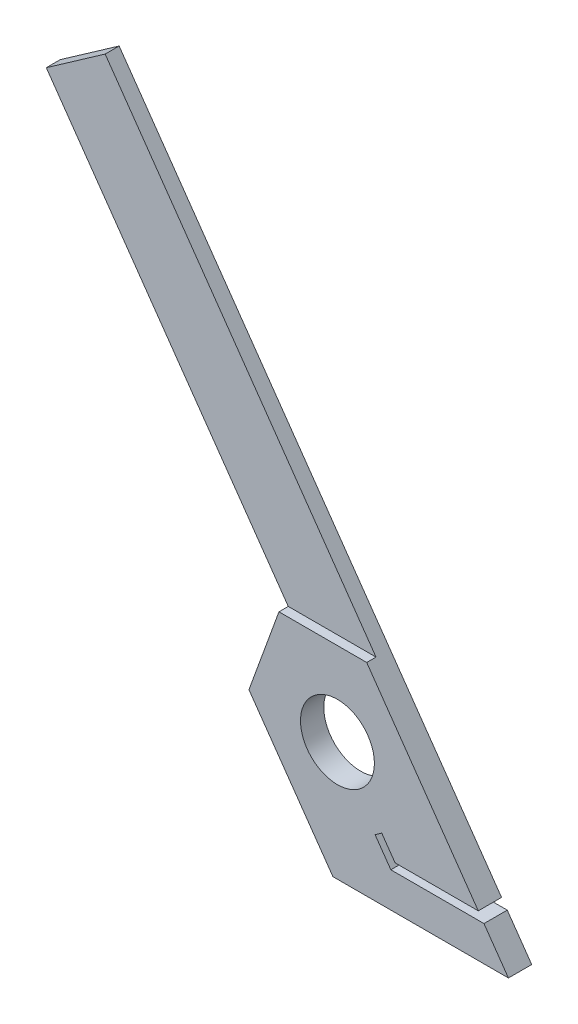
ISO-10303-21;
HEADER;
FILE_DESCRIPTION(('STEP AP214'),'2;1');
FILE_NAME('part.step','',(''),(''),'','','');
FILE_SCHEMA(('AUTOMOTIVE_DESIGN { 1 0 10303 214 1 1 1 1 }'));
ENDSEC;
DATA;
#1=APPLICATION_CONTEXT('core data for automotive mechanical design processes');
#2=APPLICATION_PROTOCOL_DEFINITION('international standard','automotive_design',2000,#1);
#3=PRODUCT_CONTEXT('',#1,'mechanical');
#4=PRODUCT('Part','Part','',(#3));
#5=PRODUCT_RELATED_PRODUCT_CATEGORY('part','',(#4));
#6=PRODUCT_DEFINITION_FORMATION('','',#4);
#7=PRODUCT_DEFINITION_CONTEXT('part definition',#1,'design');
#8=PRODUCT_DEFINITION('design','',#6,#7);
#9=PRODUCT_DEFINITION_SHAPE('','',#8);
#10=(LENGTH_UNIT() NAMED_UNIT(*) SI_UNIT(.MILLI.,.METRE.));
#11=(NAMED_UNIT(*) PLANE_ANGLE_UNIT() SI_UNIT($,.RADIAN.));
#12=(NAMED_UNIT(*) SI_UNIT($,.STERADIAN.) SOLID_ANGLE_UNIT());
#13=UNCERTAINTY_MEASURE_WITH_UNIT(LENGTH_MEASURE(1.E-05),#10,'distance_accuracy_value','');
#14=(GEOMETRIC_REPRESENTATION_CONTEXT(3) GLOBAL_UNCERTAINTY_ASSIGNED_CONTEXT((#13)) GLOBAL_UNIT_ASSIGNED_CONTEXT((#10,
#11,#12)) REPRESENTATION_CONTEXT('',''));
#15=CARTESIAN_POINT('',(0.,0.,0.));
#16=DIRECTION('',(0.,0.,1.));
#17=DIRECTION('',(1.,0.,0.));
#18=AXIS2_PLACEMENT_3D('',#15,#16,#17);
#19=CARTESIAN_POINT('',(0.,0.,1.2));
#20=DIRECTION('',(0.,0.,-1.));
#21=DIRECTION('',(-1.,0.,0.));
#22=AXIS2_PLACEMENT_3D('',#19,#20,#21);
#23=PLANE('',#22);
#24=DIRECTION('',(-1.,0.,0.));
#25=VECTOR('',#24,1.);
#26=CARTESIAN_POINT('',(-5.02398908665472,7.17499999999995,1.2));
#27=LINE('',#26,#25);
#28=CARTESIAN_POINT('',(2.51429399894731,7.17499999999994,1.2));
#29=VERTEX_POINT('',#28);
#30=CARTESIAN_POINT('',(-5.02398908665472,7.17499999999995,1.2));
#31=VERTEX_POINT('',#30);
#32=EDGE_CURVE('E51',#29,#31,#27,.T.);
#33=ORIENTED_EDGE('',*,*,#32,.F.);
#34=DIRECTION('',(-0.573576436351053,0.819152044288987,0.));
#35=VECTOR('',#34,1.);
#36=CARTESIAN_POINT('',(-20.7526757623129,40.4036764874722,1.2));
#37=LINE('',#36,#35);
#38=CARTESIAN_POINT('',(-20.7526757623129,40.4036764874722,1.2));
#39=VERTEX_POINT('',#38);
#40=EDGE_CURVE('E113',#29,#39,#37,.T.);
#41=ORIENTED_EDGE('',*,*,#40,.T.);
#42=DIRECTION('',(-0.819152044288987,-0.573576436351053,0.));
#43=VECTOR('',#42,1.);
#44=CARTESIAN_POINT('',(-20.7526757623129,40.4036764874722,1.2));
#45=LINE('',#44,#43);
#46=CARTESIAN_POINT('',(-25.8109396357974,36.8618419930044,1.2));
#47=VERTEX_POINT('',#46);
#48=EDGE_CURVE('E57',#39,#47,#45,.T.);
#49=ORIENTED_EDGE('',*,*,#48,.T.);
#50=DIRECTION('',(0.573576436351053,-0.819152044288987,0.));
#51=VECTOR('',#50,1.);
#52=CARTESIAN_POINT('',(-5.02398908665472,7.17499999999995,1.2));
#53=LINE('',#52,#51);
#54=EDGE_CURVE('E123',#47,#31,#53,.T.);
#55=ORIENTED_EDGE('',*,*,#54,.T.);
#56=EDGE_LOOP('',(#33,#41,#49,#55));
#57=FACE_BOUND('',#56,.T.);
#58=ADVANCED_FACE('F34',(#57),#23,.F.);
#59=CARTESIAN_POINT('',(0.,0.,0.));
#60=DIRECTION('',(0.,0.,-1.));
#61=DIRECTION('',(-1.,0.,0.));
#62=AXIS2_PLACEMENT_3D('',#59,#60,#61);
#63=PLANE('',#62);
#64=DIRECTION('',(1.,0.,0.));
#65=VECTOR('',#64,1.);
#66=CARTESIAN_POINT('',(14.688802777597,-10.2120004452926,0.));
#67=LINE('',#66,#65);
#68=CARTESIAN_POINT('',(-0.387763393607094,-10.2120004452926,0.));
#69=VERTEX_POINT('',#68);
#70=CARTESIAN_POINT('',(14.688802777597,-10.2120004452926,0.));
#71=VERTEX_POINT('',#70);
#72=EDGE_CURVE('E119',#69,#71,#67,.T.);
#73=ORIENTED_EDGE('',*,*,#72,.F.);
#74=DIRECTION('',(0.573576436351053,-0.819152044288987,0.));
#75=VECTOR('',#74,1.);
#76=CARTESIAN_POINT('',(-0.387763393607094,-10.2120004452926,0.));
#77=LINE('',#76,#75);
#78=CARTESIAN_POINT('',(-7.60223374802173,0.091331011064511,0.));
#79=VERTEX_POINT('',#78);
#80=EDGE_CURVE('E101',#79,#69,#77,.T.);
#81=ORIENTED_EDGE('',*,*,#80,.F.);
#82=DIRECTION('',(-0.342020143325663,-0.939692620785911,0.));
#83=VECTOR('',#82,1.);
#84=CARTESIAN_POINT('',(-7.60223374802173,0.091331011064511,0.));
#85=LINE('',#84,#83);
#86=CARTESIAN_POINT('',(-5.02398908665472,7.17499999999995,0.));
#87=VERTEX_POINT('',#86);
#88=EDGE_CURVE('E114',#87,#79,#85,.T.);
#89=ORIENTED_EDGE('',*,*,#88,.F.);
#90=DIRECTION('',(0.573576436351053,-0.819152044288987,0.));
#91=VECTOR('',#90,1.);
#92=CARTESIAN_POINT('',(-5.02398908665472,7.17499999999995,0.));
#93=LINE('',#92,#91);
#94=CARTESIAN_POINT('',(-25.8109396357974,36.8618419930044,0.));
#95=VERTEX_POINT('',#94);
#96=EDGE_CURVE('E152',#95,#87,#93,.T.);
#97=ORIENTED_EDGE('',*,*,#96,.F.);
#98=DIRECTION('',(-0.819152044288987,-0.573576436351053,0.));
#99=VECTOR('',#98,1.);
#100=CARTESIAN_POINT('',(-20.7526757623129,40.4036764874722,0.));
#101=LINE('',#100,#99);
#102=CARTESIAN_POINT('',(-20.7526757623129,40.4036764874722,0.));
#103=VERTEX_POINT('',#102);
#104=EDGE_CURVE('E150',#103,#95,#101,.T.);
#105=ORIENTED_EDGE('',*,*,#104,.F.);
#106=DIRECTION('',(-0.573576436351053,0.819152044288987,0.));
#107=VECTOR('',#106,1.);
#108=CARTESIAN_POINT('',(-20.7526757623129,40.4036764874722,0.));
#109=LINE('',#108,#107);
#110=CARTESIAN_POINT('',(12.098034886221,-6.51200044529264,0.));
#111=VERTEX_POINT('',#110);
#112=EDGE_CURVE('E148',#111,#103,#109,.T.);
#113=ORIENTED_EDGE('',*,*,#112,.F.);
#114=DIRECTION('',(1.,0.,0.));
#115=VECTOR('',#114,1.);
#116=CARTESIAN_POINT('',(12.098034886221,-6.51200044529264,0.));
#117=LINE('',#116,#115);
#118=CARTESIAN_POINT('',(4.95257709835403,-6.51200044529264,0.));
#119=VERTEX_POINT('',#118);
#120=EDGE_CURVE('E146',#119,#111,#117,.T.);
#121=ORIENTED_EDGE('',*,*,#120,.F.);
#122=DIRECTION('',(0.573576436351053,-0.819152044288987,0.));
#123=VECTOR('',#122,1.);
#124=CARTESIAN_POINT('',(3.80542422565192,-4.87369635671467,0.));
#125=LINE('',#124,#123);
#126=CARTESIAN_POINT('',(3.80542422565192,-4.87369635671467,0.));
#127=VERTEX_POINT('',#126);
#128=EDGE_CURVE('E144',#127,#119,#125,.T.);
#129=ORIENTED_EDGE('',*,*,#128,.F.);
#130=DIRECTION('',(0.819152044288987,0.573576436351053,0.));
#131=VECTOR('',#130,1.);
#132=CARTESIAN_POINT('',(3.23201779464963,-5.2751998621604,0.));
#133=LINE('',#132,#131);
#134=CARTESIAN_POINT('',(3.23201779464963,-5.2751998621604,0.));
#135=VERTEX_POINT('',#134);
#136=EDGE_CURVE('E142',#135,#127,#133,.T.);
#137=ORIENTED_EDGE('',*,*,#136,.F.);
#138=DIRECTION('',(-0.573576436351053,0.819152044288987,0.));
#139=VECTOR('',#138,1.);
#140=CARTESIAN_POINT('',(4.58818016296781,-7.21200044529264,0.));
#141=LINE('',#140,#139);
#142=CARTESIAN_POINT('',(4.58818016296781,-7.21200044529264,0.));
#143=VERTEX_POINT('',#142);
#144=EDGE_CURVE('E140',#143,#135,#141,.T.);
#145=ORIENTED_EDGE('',*,*,#144,.F.);
#146=DIRECTION('',(-1.,0.,0.));
#147=VECTOR('',#146,1.);
#148=CARTESIAN_POINT('',(4.58818016296781,-7.21200044529264,0.));
#149=LINE('',#148,#147);
#150=CARTESIAN_POINT('',(12.5881801629678,-7.21200044529264,0.));
#151=VERTEX_POINT('',#150);
#152=EDGE_CURVE('E131',#151,#143,#149,.T.);
#153=ORIENTED_EDGE('',*,*,#152,.F.);
#154=DIRECTION('',(-0.573576436351053,0.819152044288987,0.));
#155=VECTOR('',#154,1.);
#156=CARTESIAN_POINT('',(12.5881801629678,-7.21200044529264,0.));
#157=LINE('',#156,#155);
#158=EDGE_CURVE('E128',#71,#151,#157,.T.);
#159=ORIENTED_EDGE('',*,*,#158,.F.);
#160=EDGE_LOOP('',(#73,#81,#89,#97,#105,#113,#121,#129,#137,#145,#153,#159));
#161=FACE_BOUND('',#160,.T.);
#162=CARTESIAN_POINT('',(0.,0.,0.));
#163=DIRECTION('',(0.,0.,1.));
#164=DIRECTION('',(1.,0.,0.));
#165=AXIS2_PLACEMENT_3D('',#162,#163,#164);
#166=CIRCLE('',#165,3.175);
#167=CARTESIAN_POINT('',(3.175,0.,0.));
#168=VERTEX_POINT('',#167);
#169=EDGE_CURVE('E129',#168,#168,#166,.T.);
#170=ORIENTED_EDGE('',*,*,#169,.T.);
#171=EDGE_LOOP('',(#170));
#172=FACE_BOUND('',#171,.T.);
#173=ADVANCED_FACE('F125',(#161,#172),#63,.T.);
#174=CARTESIAN_POINT('',(14.688802777597,-10.2120004452926,1.2));
#175=DIRECTION('',(0.,1.,0.));
#176=DIRECTION('',(0.,0.,1.));
#177=AXIS2_PLACEMENT_3D('',#174,#175,#176);
#178=PLANE('',#177);
#179=ORIENTED_EDGE('',*,*,#72,.T.);
#180=DIRECTION('',(0.,0.,-1.));
#181=VECTOR('',#180,1.);
#182=CARTESIAN_POINT('',(14.688802777597,-10.2120004452926,1.2));
#183=LINE('',#182,#181);
#184=CARTESIAN_POINT('',(14.688802777597,-10.2120004452926,2.));
#185=VERTEX_POINT('',#184);
#186=EDGE_CURVE('E11',#185,#71,#183,.T.);
#187=ORIENTED_EDGE('',*,*,#186,.F.);
#188=DIRECTION('',(1.,0.,0.));
#189=VECTOR('',#188,1.);
#190=CARTESIAN_POINT('',(-0.387763393607094,-10.2120004452926,2.));
#191=LINE('',#190,#189);
#192=CARTESIAN_POINT('',(-0.387763393607094,-10.2120004452926,2.));
#193=VERTEX_POINT('',#192);
#194=EDGE_CURVE('E121',#193,#185,#191,.T.);
#195=ORIENTED_EDGE('',*,*,#194,.F.);
#196=DIRECTION('',(0.,0.,-1.));
#197=VECTOR('',#196,1.);
#198=CARTESIAN_POINT('',(-0.387763393607094,-10.2120004452926,1.2));
#199=LINE('',#198,#197);
#200=EDGE_CURVE('E106',#193,#69,#199,.T.);
#201=ORIENTED_EDGE('',*,*,#200,.T.);
#202=EDGE_LOOP('',(#179,#187,#195,#201));
#203=FACE_BOUND('',#202,.T.);
#204=ADVANCED_FACE('F36',(#203),#178,.F.);
#205=CARTESIAN_POINT('',(12.5881801629678,-7.21200044529264,1.2));
#206=DIRECTION('',(-0.819152044288987,-0.573576436351053,0.));
#207=DIRECTION('',(0.573576436351053,-0.819152044288987,0.));
#208=AXIS2_PLACEMENT_3D('',#205,#206,#207);
#209=PLANE('',#208);
#210=ORIENTED_EDGE('',*,*,#158,.T.);
#211=DIRECTION('',(0.,0.,-1.));
#212=VECTOR('',#211,1.);
#213=CARTESIAN_POINT('',(12.5881801629678,-7.21200044529264,1.2));
#214=LINE('',#213,#212);
#215=CARTESIAN_POINT('',(12.5881801629678,-7.21200044529264,2.));
#216=VERTEX_POINT('',#215);
#217=EDGE_CURVE('E43',#216,#151,#214,.T.);
#218=ORIENTED_EDGE('',*,*,#217,.F.);
#219=DIRECTION('',(-0.573576436351053,0.819152044288987,0.));
#220=VECTOR('',#219,1.);
#221=CARTESIAN_POINT('',(14.688802777597,-10.2120004452926,2.));
#222=LINE('',#221,#220);
#223=EDGE_CURVE('E230',#185,#216,#222,.T.);
#224=ORIENTED_EDGE('',*,*,#223,.F.);
#225=ORIENTED_EDGE('',*,*,#186,.T.);
#226=EDGE_LOOP('',(#210,#218,#224,#225));
#227=FACE_BOUND('',#226,.T.);
#228=ADVANCED_FACE('F291',(#227),#209,.F.);
#229=CARTESIAN_POINT('',(4.58818016296781,-7.21200044529264,1.2));
#230=DIRECTION('',(0.,-1.,0.));
#231=DIRECTION('',(1.,0.,0.));
#232=AXIS2_PLACEMENT_3D('',#229,#230,#231);
#233=PLANE('',#232);
#234=ORIENTED_EDGE('',*,*,#152,.T.);
#235=DIRECTION('',(0.,0.,-1.));
#236=VECTOR('',#235,1.);
#237=CARTESIAN_POINT('',(4.58818016296781,-7.21200044529264,1.2));
#238=LINE('',#237,#236);
#239=CARTESIAN_POINT('',(4.58818016296781,-7.21200044529264,2.));
#240=VERTEX_POINT('',#239);
#241=EDGE_CURVE('E177',#240,#143,#238,.T.);
#242=ORIENTED_EDGE('',*,*,#241,.F.);
#243=DIRECTION('',(-1.,0.,0.));
#244=VECTOR('',#243,1.);
#245=CARTESIAN_POINT('',(12.5881801629678,-7.21200044529264,2.));
#246=LINE('',#245,#244);
#247=EDGE_CURVE('E227',#216,#240,#246,.T.);
#248=ORIENTED_EDGE('',*,*,#247,.F.);
#249=ORIENTED_EDGE('',*,*,#217,.T.);
#250=EDGE_LOOP('',(#234,#242,#248,#249));
#251=FACE_BOUND('',#250,.T.);
#252=ADVANCED_FACE('F288',(#251),#233,.F.);
#253=CARTESIAN_POINT('',(4.58818016296781,-7.21200044529264,1.2));
#254=DIRECTION('',(-0.819152044288987,-0.573576436351053,0.));
#255=DIRECTION('',(0.573576436351053,-0.819152044288987,0.));
#256=AXIS2_PLACEMENT_3D('',#253,#254,#255);
#257=PLANE('',#256);
#258=ORIENTED_EDGE('',*,*,#144,.T.);
#259=DIRECTION('',(0.,0.,-1.));
#260=VECTOR('',#259,1.);
#261=CARTESIAN_POINT('',(3.23201779464963,-5.2751998621604,1.2));
#262=LINE('',#261,#260);
#263=CARTESIAN_POINT('',(3.23201779464963,-5.2751998621604,2.));
#264=VERTEX_POINT('',#263);
#265=EDGE_CURVE('E174',#264,#135,#262,.T.);
#266=ORIENTED_EDGE('',*,*,#265,.F.);
#267=DIRECTION('',(-0.573576436351053,0.819152044288987,0.));
#268=VECTOR('',#267,1.);
#269=CARTESIAN_POINT('',(4.58818016296781,-7.21200044529264,2.));
#270=LINE('',#269,#268);
#271=EDGE_CURVE('E224',#240,#264,#270,.T.);
#272=ORIENTED_EDGE('',*,*,#271,.F.);
#273=ORIENTED_EDGE('',*,*,#241,.T.);
#274=EDGE_LOOP('',(#258,#266,#272,#273));
#275=FACE_BOUND('',#274,.T.);
#276=ADVANCED_FACE('F284',(#275),#257,.F.);
#277=CARTESIAN_POINT('',(3.23201779464963,-5.2751998621604,1.2));
#278=DIRECTION('',(-0.573576436351053,0.819152044288987,0.));
#279=DIRECTION('',(-0.819152044288987,-0.573576436351053,0.));
#280=AXIS2_PLACEMENT_3D('',#277,#278,#279);
#281=PLANE('',#280);
#282=ORIENTED_EDGE('',*,*,#136,.T.);
#283=DIRECTION('',(0.,0.,-1.));
#284=VECTOR('',#283,1.);
#285=CARTESIAN_POINT('',(3.80542422565192,-4.87369635671467,1.2));
#286=LINE('',#285,#284);
#287=CARTESIAN_POINT('',(3.80542422565192,-4.87369635671467,2.));
#288=VERTEX_POINT('',#287);
#289=EDGE_CURVE('E171',#288,#127,#286,.T.);
#290=ORIENTED_EDGE('',*,*,#289,.F.);
#291=DIRECTION('',(0.819152044288987,0.573576436351053,0.));
#292=VECTOR('',#291,1.);
#293=CARTESIAN_POINT('',(3.23201779464963,-5.2751998621604,2.));
#294=LINE('',#293,#292);
#295=EDGE_CURVE('E221',#264,#288,#294,.T.);
#296=ORIENTED_EDGE('',*,*,#295,.F.);
#297=ORIENTED_EDGE('',*,*,#265,.T.);
#298=EDGE_LOOP('',(#282,#290,#296,#297));
#299=FACE_BOUND('',#298,.T.);
#300=ADVANCED_FACE('F280',(#299),#281,.F.);
#301=CARTESIAN_POINT('',(3.80542422565192,-4.87369635671467,1.2));
#302=DIRECTION('',(0.819152044288987,0.573576436351053,0.));
#303=DIRECTION('',(-0.573576436351053,0.819152044288987,0.));
#304=AXIS2_PLACEMENT_3D('',#301,#302,#303);
#305=PLANE('',#304);
#306=ORIENTED_EDGE('',*,*,#128,.T.);
#307=DIRECTION('',(0.,0.,-1.));
#308=VECTOR('',#307,1.);
#309=CARTESIAN_POINT('',(4.95257709835403,-6.51200044529264,1.2));
#310=LINE('',#309,#308);
#311=CARTESIAN_POINT('',(4.95257709835403,-6.51200044529264,2.));
#312=VERTEX_POINT('',#311);
#313=EDGE_CURVE('E168',#312,#119,#310,.T.);
#314=ORIENTED_EDGE('',*,*,#313,.F.);
#315=DIRECTION('',(0.573576436351053,-0.819152044288987,0.));
#316=VECTOR('',#315,1.);
#317=CARTESIAN_POINT('',(3.80542422565192,-4.87369635671467,2.));
#318=LINE('',#317,#316);
#319=EDGE_CURVE('E218',#288,#312,#318,.T.);
#320=ORIENTED_EDGE('',*,*,#319,.F.);
#321=ORIENTED_EDGE('',*,*,#289,.T.);
#322=EDGE_LOOP('',(#306,#314,#320,#321));
#323=FACE_BOUND('',#322,.T.);
#324=ADVANCED_FACE('F276',(#323),#305,.F.);
#325=CARTESIAN_POINT('',(12.098034886221,-6.51200044529264,1.2));
#326=DIRECTION('',(0.,1.,0.));
#327=DIRECTION('',(-1.,0.,0.));
#328=AXIS2_PLACEMENT_3D('',#325,#326,#327);
#329=PLANE('',#328);
#330=ORIENTED_EDGE('',*,*,#120,.T.);
#331=DIRECTION('',(0.,0.,-1.));
#332=VECTOR('',#331,1.);
#333=CARTESIAN_POINT('',(12.098034886221,-6.51200044529264,1.2));
#334=LINE('',#333,#332);
#335=CARTESIAN_POINT('',(12.098034886221,-6.51200044529264,2.));
#336=VERTEX_POINT('',#335);
#337=EDGE_CURVE('E165',#336,#111,#334,.T.);
#338=ORIENTED_EDGE('',*,*,#337,.F.);
#339=DIRECTION('',(1.,0.,0.));
#340=VECTOR('',#339,1.);
#341=CARTESIAN_POINT('',(4.95257709835403,-6.51200044529264,2.));
#342=LINE('',#341,#340);
#343=EDGE_CURVE('E215',#312,#336,#342,.T.);
#344=ORIENTED_EDGE('',*,*,#343,.F.);
#345=ORIENTED_EDGE('',*,*,#313,.T.);
#346=EDGE_LOOP('',(#330,#338,#344,#345));
#347=FACE_BOUND('',#346,.T.);
#348=ADVANCED_FACE('F272',(#347),#329,.F.);
#349=CARTESIAN_POINT('',(-20.7526757623129,40.4036764874722,1.2));
#350=DIRECTION('',(-0.819152044288987,-0.573576436351053,0.));
#351=DIRECTION('',(0.573576436351053,-0.819152044288987,0.));
#352=AXIS2_PLACEMENT_3D('',#349,#350,#351);
#353=PLANE('',#352);
#354=ORIENTED_EDGE('',*,*,#112,.T.);
#355=DIRECTION('',(0.,0.,-1.));
#356=VECTOR('',#355,1.);
#357=CARTESIAN_POINT('',(-20.7526757623129,40.4036764874722,1.2));
#358=LINE('',#357,#356);
#359=EDGE_CURVE('E162',#39,#103,#358,.T.);
#360=ORIENTED_EDGE('',*,*,#359,.F.);
#361=ORIENTED_EDGE('',*,*,#40,.F.);
#362=DIRECTION('',(0.,0.,-1.));
#363=VECTOR('',#362,1.);
#364=CARTESIAN_POINT('',(2.51429399894731,7.17499999999995,2.));
#365=LINE('',#364,#363);
#366=CARTESIAN_POINT('',(2.51429399894731,7.17499999999995,2.));
#367=VERTEX_POINT('',#366);
#368=EDGE_CURVE('E134',#367,#29,#365,.T.);
#369=ORIENTED_EDGE('',*,*,#368,.F.);
#370=DIRECTION('',(-0.573576436351053,0.819152044288987,0.));
#371=VECTOR('',#370,1.);
#372=CARTESIAN_POINT('',(12.098034886221,-6.51200044529264,2.));
#373=LINE('',#372,#371);
#374=EDGE_CURVE('E212',#336,#367,#373,.T.);
#375=ORIENTED_EDGE('',*,*,#374,.F.);
#376=ORIENTED_EDGE('',*,*,#337,.T.);
#377=EDGE_LOOP('',(#354,#360,#361,#369,#375,#376));
#378=FACE_BOUND('',#377,.T.);
#379=ADVANCED_FACE('F268',(#378),#353,.F.);
#380=CARTESIAN_POINT('',(-20.7526757623129,40.4036764874722,1.2));
#381=DIRECTION('',(0.573576436351053,-0.819152044288987,0.));
#382=DIRECTION('',(0.819152044288987,0.573576436351053,0.));
#383=AXIS2_PLACEMENT_3D('',#380,#381,#382);
#384=PLANE('',#383);
#385=ORIENTED_EDGE('',*,*,#104,.T.);
#386=DIRECTION('',(0.,0.,-1.));
#387=VECTOR('',#386,1.);
#388=CARTESIAN_POINT('',(-25.8109396357974,36.8618419930044,1.2));
#389=LINE('',#388,#387);
#390=EDGE_CURVE('E159',#47,#95,#389,.T.);
#391=ORIENTED_EDGE('',*,*,#390,.F.);
#392=ORIENTED_EDGE('',*,*,#48,.F.);
#393=ORIENTED_EDGE('',*,*,#359,.T.);
#394=EDGE_LOOP('',(#385,#391,#392,#393));
#395=FACE_BOUND('',#394,.T.);
#396=ADVANCED_FACE('F265',(#395),#384,.F.);
#397=CARTESIAN_POINT('',(-5.02398908665472,7.17499999999995,1.2));
#398=DIRECTION('',(0.819152044288987,0.573576436351053,0.));
#399=DIRECTION('',(-0.573576436351053,0.819152044288987,0.));
#400=AXIS2_PLACEMENT_3D('',#397,#398,#399);
#401=PLANE('',#400);
#402=ORIENTED_EDGE('',*,*,#96,.T.);
#403=DIRECTION('',(0.,0.,-1.));
#404=VECTOR('',#403,1.);
#405=CARTESIAN_POINT('',(-5.02398908665472,7.17499999999995,1.2));
#406=LINE('',#405,#404);
#407=EDGE_CURVE('E156',#31,#87,#406,.T.);
#408=ORIENTED_EDGE('',*,*,#407,.F.);
#409=ORIENTED_EDGE('',*,*,#54,.F.);
#410=ORIENTED_EDGE('',*,*,#390,.T.);
#411=EDGE_LOOP('',(#402,#408,#409,#410));
#412=FACE_BOUND('',#411,.T.);
#413=ADVANCED_FACE('F262',(#412),#401,.F.);
#414=CARTESIAN_POINT('',(-7.60223374802173,0.091331011064511,1.2));
#415=DIRECTION('',(0.939692620785911,-0.342020143325663,0.));
#416=DIRECTION('',(0.342020143325663,0.939692620785911,0.));
#417=AXIS2_PLACEMENT_3D('',#414,#415,#416);
#418=PLANE('',#417);
#419=ORIENTED_EDGE('',*,*,#88,.T.);
#420=DIRECTION('',(0.,0.,-1.));
#421=VECTOR('',#420,1.);
#422=CARTESIAN_POINT('',(-7.60223374802173,0.091331011064511,1.2));
#423=LINE('',#422,#421);
#424=CARTESIAN_POINT('',(-7.60223374802173,0.091331011064511,2.));
#425=VERTEX_POINT('',#424);
#426=EDGE_CURVE('E109',#425,#79,#423,.T.);
#427=ORIENTED_EDGE('',*,*,#426,.F.);
#428=DIRECTION('',(-0.342020143325663,-0.939692620785911,0.));
#429=VECTOR('',#428,1.);
#430=CARTESIAN_POINT('',(-5.02398908665472,7.17499999999995,2.));
#431=LINE('',#430,#429);
#432=CARTESIAN_POINT('',(-5.02398908665472,7.17499999999995,2.));
#433=VERTEX_POINT('',#432);
#434=EDGE_CURVE('E206',#433,#425,#431,.T.);
#435=ORIENTED_EDGE('',*,*,#434,.F.);
#436=DIRECTION('',(0.,0.,-1.));
#437=VECTOR('',#436,1.);
#438=CARTESIAN_POINT('',(-5.02398908665472,7.17499999999995,2.));
#439=LINE('',#438,#437);
#440=EDGE_CURVE('E198',#433,#31,#439,.T.);
#441=ORIENTED_EDGE('',*,*,#440,.T.);
#442=ORIENTED_EDGE('',*,*,#407,.T.);
#443=EDGE_LOOP('',(#419,#427,#435,#441,#442));
#444=FACE_BOUND('',#443,.T.);
#445=ADVANCED_FACE('F204',(#444),#418,.F.);
#446=CARTESIAN_POINT('',(-0.387763393607094,-10.2120004452926,1.2));
#447=DIRECTION('',(0.819152044288987,0.573576436351053,0.));
#448=DIRECTION('',(-0.573576436351053,0.819152044288987,0.));
#449=AXIS2_PLACEMENT_3D('',#446,#447,#448);
#450=PLANE('',#449);
#451=ORIENTED_EDGE('',*,*,#80,.T.);
#452=ORIENTED_EDGE('',*,*,#200,.F.);
#453=DIRECTION('',(0.573576436351053,-0.819152044288987,0.));
#454=VECTOR('',#453,1.);
#455=CARTESIAN_POINT('',(-7.60223374802173,0.091331011064511,2.));
#456=LINE('',#455,#454);
#457=EDGE_CURVE('E201',#425,#193,#456,.T.);
#458=ORIENTED_EDGE('',*,*,#457,.F.);
#459=ORIENTED_EDGE('',*,*,#426,.T.);
#460=EDGE_LOOP('',(#451,#452,#458,#459));
#461=FACE_BOUND('',#460,.T.);
#462=ADVANCED_FACE('F103',(#461),#450,.F.);
#463=CARTESIAN_POINT('',(0.,0.,1.2));
#464=DIRECTION('',(0.,0.,-1.));
#465=DIRECTION('',(-1.,0.,0.));
#466=AXIS2_PLACEMENT_3D('',#463,#464,#465);
#467=CYLINDRICAL_SURFACE('',#466,3.175);
#468=ORIENTED_EDGE('',*,*,#169,.F.);
#469=EDGE_LOOP('',(#468));
#470=FACE_BOUND('',#469,.T.);
#471=CARTESIAN_POINT('',(0.,0.,2.));
#472=DIRECTION('',(0.,0.,1.));
#473=DIRECTION('',(1.,0.,0.));
#474=AXIS2_PLACEMENT_3D('',#471,#472,#473);
#475=CIRCLE('',#474,3.175);
#476=CARTESIAN_POINT('',(3.175,0.,2.));
#477=VERTEX_POINT('',#476);
#478=EDGE_CURVE('E202',#477,#477,#475,.T.);
#479=ORIENTED_EDGE('',*,*,#478,.T.);
#480=EDGE_LOOP('',(#479));
#481=FACE_BOUND('',#480,.T.);
#482=ADVANCED_FACE('F238',(#470,#481),#467,.F.);
#483=CARTESIAN_POINT('',(0.,0.,2.));
#484=DIRECTION('',(0.,0.,1.));
#485=DIRECTION('',(1.,0.,0.));
#486=AXIS2_PLACEMENT_3D('',#483,#484,#485);
#487=PLANE('',#486);
#488=ORIENTED_EDGE('',*,*,#457,.T.);
#489=ORIENTED_EDGE('',*,*,#194,.T.);
#490=ORIENTED_EDGE('',*,*,#223,.T.);
#491=ORIENTED_EDGE('',*,*,#247,.T.);
#492=ORIENTED_EDGE('',*,*,#271,.T.);
#493=ORIENTED_EDGE('',*,*,#295,.T.);
#494=ORIENTED_EDGE('',*,*,#319,.T.);
#495=ORIENTED_EDGE('',*,*,#343,.T.);
#496=ORIENTED_EDGE('',*,*,#374,.T.);
#497=DIRECTION('',(-1.,0.,0.));
#498=VECTOR('',#497,1.);
#499=CARTESIAN_POINT('',(-5.02398908665472,7.17499999999995,2.));
#500=LINE('',#499,#498);
#501=EDGE_CURVE('E207',#367,#433,#500,.T.);
#502=ORIENTED_EDGE('',*,*,#501,.T.);
#503=ORIENTED_EDGE('',*,*,#434,.T.);
#504=EDGE_LOOP('',(#488,#489,#490,#491,#492,#493,#494,#495,#496,#502,#503));
#505=FACE_BOUND('',#504,.T.);
#506=ORIENTED_EDGE('',*,*,#478,.F.);
#507=EDGE_LOOP('',(#506));
#508=FACE_BOUND('',#507,.T.);
#509=ADVANCED_FACE('F240',(#505,#508),#487,.T.);
#510=CARTESIAN_POINT('',(-5.02398908665472,7.17499999999995,2.));
#511=DIRECTION('',(0.,-1.,0.));
#512=DIRECTION('',(0.,0.,-1.));
#513=AXIS2_PLACEMENT_3D('',#510,#511,#512);
#514=PLANE('',#513);
#515=ORIENTED_EDGE('',*,*,#32,.T.);
#516=ORIENTED_EDGE('',*,*,#440,.F.);
#517=ORIENTED_EDGE('',*,*,#501,.F.);
#518=ORIENTED_EDGE('',*,*,#368,.T.);
#519=EDGE_LOOP('',(#515,#516,#517,#518));
#520=FACE_BOUND('',#519,.T.);
#521=ADVANCED_FACE('F195',(#520),#514,.F.);
#522=CLOSED_SHELL('',(#58,#173,#204,#228,#252,#276,#300,#324,#348,#379,#396,#413,#445,#462,#482,
#509,#521));
#523=MANIFOLD_SOLID_BREP('B2',#522);
#524=ADVANCED_BREP_SHAPE_REPRESENTATION('',(#18,#523),#14);
#525=SHAPE_DEFINITION_REPRESENTATION(#9,#524);
ENDSEC;
END-ISO-10303-21;
